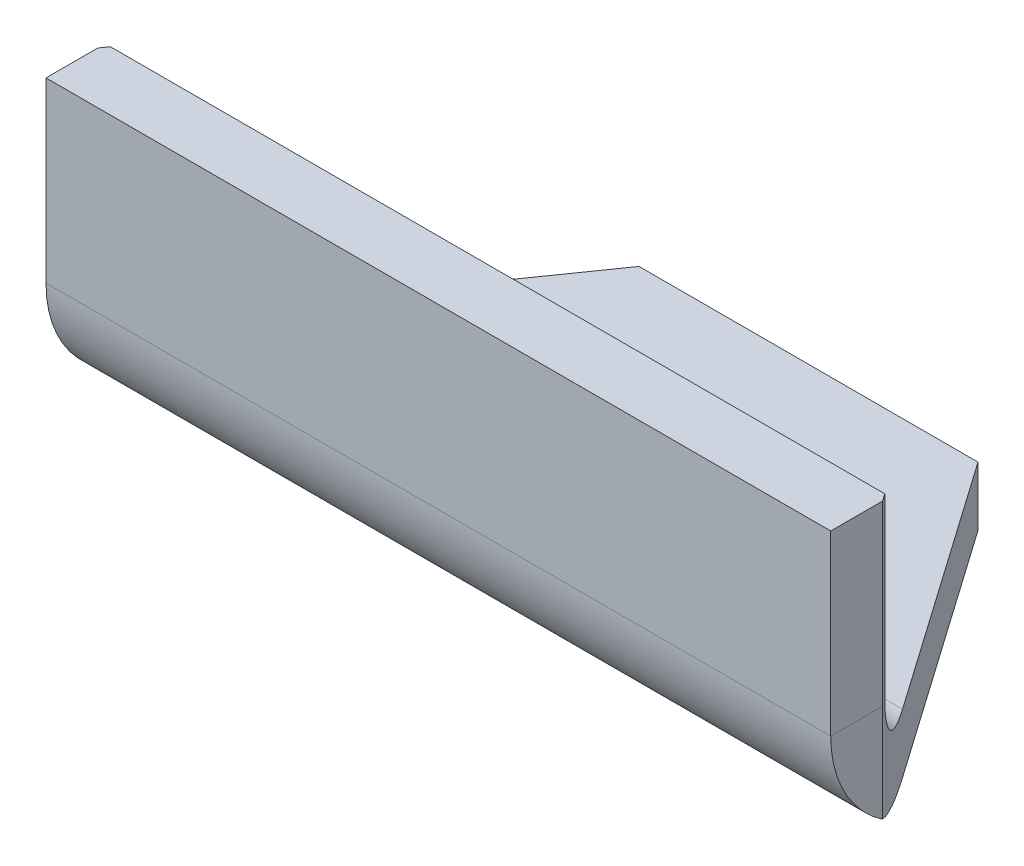
ISO-10303-21;
HEADER;
FILE_DESCRIPTION(('STEP AP214'),'2;1');
FILE_NAME('part.step','',(''),(''),'','','');
FILE_SCHEMA(('AUTOMOTIVE_DESIGN { 1 0 10303 214 1 1 1 1 }'));
ENDSEC;
DATA;
#1=APPLICATION_CONTEXT('core data for automotive mechanical design processes');
#2=APPLICATION_PROTOCOL_DEFINITION('international standard','automotive_design',2000,#1);
#3=PRODUCT_CONTEXT('',#1,'mechanical');
#4=PRODUCT('Part','Part','',(#3));
#5=PRODUCT_RELATED_PRODUCT_CATEGORY('part','',(#4));
#6=PRODUCT_DEFINITION_FORMATION('','',#4);
#7=PRODUCT_DEFINITION_CONTEXT('part definition',#1,'design');
#8=PRODUCT_DEFINITION('design','',#6,#7);
#9=PRODUCT_DEFINITION_SHAPE('','',#8);
#10=(LENGTH_UNIT() NAMED_UNIT(*) SI_UNIT(.MILLI.,.METRE.));
#11=(NAMED_UNIT(*) PLANE_ANGLE_UNIT() SI_UNIT($,.RADIAN.));
#12=(NAMED_UNIT(*) SI_UNIT($,.STERADIAN.) SOLID_ANGLE_UNIT());
#13=UNCERTAINTY_MEASURE_WITH_UNIT(LENGTH_MEASURE(1.E-05),#10,'distance_accuracy_value','');
#14=(GEOMETRIC_REPRESENTATION_CONTEXT(3) GLOBAL_UNCERTAINTY_ASSIGNED_CONTEXT((#13)) GLOBAL_UNIT_ASSIGNED_CONTEXT((#10,
#11,#12)) REPRESENTATION_CONTEXT('',''));
#15=CARTESIAN_POINT('',(0.,0.,0.));
#16=DIRECTION('',(0.,0.,1.));
#17=DIRECTION('',(1.,0.,0.));
#18=AXIS2_PLACEMENT_3D('',#15,#16,#17);
#19=CARTESIAN_POINT('',(0.,-8.,0.));
#20=DIRECTION('',(0.,-1.,0.));
#21=DIRECTION('',(0.,0.,-1.));
#22=AXIS2_PLACEMENT_3D('',#19,#20,#21);
#23=PLANE('',#22);
#24=DIRECTION('',(-1.,0.,0.));
#25=VECTOR('',#24,1.);
#26=CARTESIAN_POINT('',(-53.,-8.,-25.));
#27=LINE('',#26,#25);
#28=CARTESIAN_POINT('',(22.8910758569819,-8.,-25.));
#29=VERTEX_POINT('',#28);
#30=CARTESIAN_POINT('',(-22.8910758569819,-8.,-25.));
#31=VERTEX_POINT('',#30);
#32=EDGE_CURVE('E169',#29,#31,#27,.T.);
#33=ORIENTED_EDGE('',*,*,#32,.F.);
#34=DIRECTION('',(0.573576436351051,0.,0.819152044288988));
#35=VECTOR('',#34,1.);
#36=CARTESIAN_POINT('',(27.1063002110566,-8.,-18.9800357407575));
#37=LINE('',#36,#35);
#38=CARTESIAN_POINT('',(46.6981321561124,-8.00000000000003,9.00000000000001));
#39=VERTEX_POINT('',#38);
#40=EDGE_CURVE('E197',#39,#29,#37,.F.);
#41=ORIENTED_EDGE('',*,*,#40,.F.);
#42=DIRECTION('',(1.,0.,0.));
#43=VECTOR('',#42,1.);
#44=CARTESIAN_POINT('',(53.,-8.00000000000003,9.00000000000001));
#45=LINE('',#44,#43);
#46=CARTESIAN_POINT('',(-46.6981321561124,-8.00000000000003,9.00000000000001));
#47=VERTEX_POINT('',#46);
#48=EDGE_CURVE('E82',#39,#47,#45,.F.);
#49=ORIENTED_EDGE('',*,*,#48,.T.);
#50=DIRECTION('',(-0.573576436351051,0.,0.819152044288988));
#51=VECTOR('',#50,1.);
#52=CARTESIAN_POINT('',(-27.1063002110566,-8.,-18.9800357407575));
#53=LINE('',#52,#51);
#54=EDGE_CURVE('E13',#47,#31,#53,.F.);
#55=ORIENTED_EDGE('',*,*,#54,.T.);
#56=EDGE_LOOP('',(#33,#41,#49,#55));
#57=FACE_BOUND('',#56,.T.);
#58=ADVANCED_FACE('F59',(#57),#23,.T.);
#59=CARTESIAN_POINT('',(0.,0.,0.));
#60=DIRECTION('',(0.,-1.,0.));
#61=DIRECTION('',(0.,0.,-1.));
#62=AXIS2_PLACEMENT_3D('',#59,#60,#61);
#63=PLANE('',#62);
#64=DIRECTION('',(-0.573576436351051,0.,-0.819152044288988));
#65=VECTOR('',#64,1.);
#66=CARTESIAN_POINT('',(22.8910758569819,0.,-25.));
#67=LINE('',#66,#65);
#68=CARTESIAN_POINT('',(22.8910758569819,0.,-25.));
#69=VERTEX_POINT('',#68);
#70=CARTESIAN_POINT('',(46.6981321561124,0.,9.00000000000001));
#71=VERTEX_POINT('',#70);
#72=EDGE_CURVE('E204',#69,#71,#67,.F.);
#73=ORIENTED_EDGE('',*,*,#72,.F.);
#74=DIRECTION('',(-1.,0.,0.));
#75=VECTOR('',#74,1.);
#76=CARTESIAN_POINT('',(-53.,0.,-25.));
#77=LINE('',#76,#75);
#78=CARTESIAN_POINT('',(-22.8910758569819,0.,-25.));
#79=VERTEX_POINT('',#78);
#80=EDGE_CURVE('E172',#69,#79,#77,.T.);
#81=ORIENTED_EDGE('',*,*,#80,.T.);
#82=DIRECTION('',(0.573576436351051,0.,-0.819152044288988));
#83=VECTOR('',#82,1.);
#84=CARTESIAN_POINT('',(-22.8910758569819,0.,-25.));
#85=LINE('',#84,#83);
#86=CARTESIAN_POINT('',(-46.6981321561124,0.,9.00000000000001));
#87=VERTEX_POINT('',#86);
#88=EDGE_CURVE('E176',#79,#87,#85,.F.);
#89=ORIENTED_EDGE('',*,*,#88,.T.);
#90=DIRECTION('',(1.,0.,0.));
#91=VECTOR('',#90,1.);
#92=CARTESIAN_POINT('',(53.,0.,9.00000000000001));
#93=LINE('',#92,#91);
#94=EDGE_CURVE('E161',#71,#87,#93,.F.);
#95=ORIENTED_EDGE('',*,*,#94,.F.);
#96=EDGE_LOOP('',(#73,#81,#89,#95));
#97=FACE_BOUND('',#96,.T.);
#98=ADVANCED_FACE('F262',(#97),#63,.F.);
#99=CARTESIAN_POINT('',(-53.,-8.,-25.));
#100=DIRECTION('',(0.,0.,-1.));
#101=DIRECTION('',(-1.,0.,0.));
#102=AXIS2_PLACEMENT_3D('',#99,#100,#101);
#103=PLANE('',#102);
#104=ORIENTED_EDGE('',*,*,#80,.F.);
#105=DIRECTION('',(0.,1.,0.));
#106=VECTOR('',#105,1.);
#107=CARTESIAN_POINT('',(22.8910758569819,-8.,-25.));
#108=LINE('',#107,#106);
#109=EDGE_CURVE('E202',#29,#69,#108,.T.);
#110=ORIENTED_EDGE('',*,*,#109,.F.);
#111=ORIENTED_EDGE('',*,*,#32,.T.);
#112=DIRECTION('',(0.,1.,0.));
#113=VECTOR('',#112,1.);
#114=CARTESIAN_POINT('',(-22.8910758569819,-8.,-25.));
#115=LINE('',#114,#113);
#116=EDGE_CURVE('E171',#31,#79,#115,.T.);
#117=ORIENTED_EDGE('',*,*,#116,.T.);
#118=EDGE_LOOP('',(#104,#110,#111,#117));
#119=FACE_BOUND('',#118,.T.);
#120=ADVANCED_FACE('F201',(#119),#103,.T.);
#121=CARTESIAN_POINT('',(53.,7.99999999999997,9.00000000000001));
#122=DIRECTION('',(-1.,0.,0.));
#123=DIRECTION('',(0.,0.,1.));
#124=AXIS2_PLACEMENT_3D('',#121,#122,#123);
#125=PLANE('',#124);
#126=CARTESIAN_POINT('',(53.,7.99999999999997,9.00000000000001));
#127=DIRECTION('',(1.,0.,0.));
#128=DIRECTION('',(0.,0.,-1.));
#129=AXIS2_PLACEMENT_3D('',#126,#127,#128);
#130=CIRCLE('',#129,16.);
#131=CARTESIAN_POINT('',(53.,7.99999999999997,25.));
#132=VERTEX_POINT('',#131);
#133=CARTESIAN_POINT('',(53.,-5.22875655532285,18.0000000000002));
#134=VERTEX_POINT('',#133);
#135=EDGE_CURVE('E156',#132,#134,#130,.T.);
#136=ORIENTED_EDGE('',*,*,#135,.T.);
#137=DIRECTION('',(0.,-1.,0.));
#138=VECTOR('',#137,1.);
#139=CARTESIAN_POINT('',(53.,7.99999999999997,18.0000000000002));
#140=LINE('',#139,#138);
#141=CARTESIAN_POINT('',(53.,7.99999999999997,18.0000000000002));
#142=VERTEX_POINT('',#141);
#143=EDGE_CURVE('E142',#142,#134,#140,.T.);
#144=ORIENTED_EDGE('',*,*,#143,.F.);
#145=DIRECTION('',(0.,0.,-1.));
#146=VECTOR('',#145,1.);
#147=CARTESIAN_POINT('',(53.,7.99999999999997,17.));
#148=LINE('',#147,#146);
#149=EDGE_CURVE('E160',#142,#132,#148,.F.);
#150=ORIENTED_EDGE('',*,*,#149,.T.);
#151=EDGE_LOOP('',(#136,#144,#150));
#152=FACE_BOUND('',#151,.T.);
#153=ADVANCED_FACE('F159',(#152),#125,.F.);
#154=CARTESIAN_POINT('',(53.,7.99999999999997,9.00000000000001));
#155=DIRECTION('',(1.,0.,0.));
#156=DIRECTION('',(0.,0.,1.));
#157=AXIS2_PLACEMENT_3D('',#154,#155,#156);
#158=CYLINDRICAL_SURFACE('',#157,16.);
#159=ORIENTED_EDGE('',*,*,#48,.F.);
#160=CARTESIAN_POINT('',(46.6981321561124,7.99999999999997,9.00000000000001));
#161=DIRECTION('',(0.819152044288988,0.,-0.573576436351051));
#162=DIRECTION('',(-0.573576436351051,0.,-0.819152044288988));
#163=AXIS2_PLACEMENT_3D('',#160,#161,#162);
#164=ELLIPSE('',#163,19.5323934201834,16.);
#165=EDGE_CURVE('E145',#134,#39,#164,.T.);
#166=ORIENTED_EDGE('',*,*,#165,.F.);
#167=ORIENTED_EDGE('',*,*,#135,.F.);
#168=DIRECTION('',(1.,0.,0.));
#169=VECTOR('',#168,1.);
#170=CARTESIAN_POINT('',(-53.,7.99999999999997,25.));
#171=LINE('',#170,#169);
#172=CARTESIAN_POINT('',(-53.,7.99999999999997,25.));
#173=VERTEX_POINT('',#172);
#174=EDGE_CURVE('E226',#132,#173,#171,.F.);
#175=ORIENTED_EDGE('',*,*,#174,.T.);
#176=CARTESIAN_POINT('',(-53.,7.99999999999997,9.00000000000001));
#177=DIRECTION('',(1.,0.,0.));
#178=DIRECTION('',(0.,0.,-1.));
#179=AXIS2_PLACEMENT_3D('',#176,#177,#178);
#180=CIRCLE('',#179,16.);
#181=CARTESIAN_POINT('',(-53.,-5.22875655532285,18.0000000000002));
#182=VERTEX_POINT('',#181);
#183=EDGE_CURVE('E163',#182,#173,#180,.F.);
#184=ORIENTED_EDGE('',*,*,#183,.F.);
#185=CARTESIAN_POINT('',(-46.6981321561124,7.99999999999997,9.00000000000001));
#186=DIRECTION('',(0.819152044288988,0.,0.573576436351051));
#187=DIRECTION('',(0.573576436351051,0.,-0.819152044288988));
#188=AXIS2_PLACEMENT_3D('',#185,#186,#187);
#189=ELLIPSE('',#188,19.5323934201834,16.);
#190=EDGE_CURVE('E68',#182,#47,#189,.T.);
#191=ORIENTED_EDGE('',*,*,#190,.T.);
#192=EDGE_LOOP('',(#159,#166,#167,#175,#184,#191));
#193=FACE_BOUND('',#192,.T.);
#194=ADVANCED_FACE('F154',(#193),#158,.T.);
#195=CARTESIAN_POINT('',(53.,7.99999999999997,9.00000000000001));
#196=DIRECTION('',(1.,0.,0.));
#197=DIRECTION('',(0.,0.,1.));
#198=AXIS2_PLACEMENT_3D('',#195,#196,#197);
#199=CYLINDRICAL_SURFACE('',#198,8.);
#200=CARTESIAN_POINT('',(46.6981321561124,7.99999999999997,9.00000000000001));
#201=DIRECTION('',(0.819152044288988,0.,-0.573576436351051));
#202=DIRECTION('',(-0.573576436351051,0.,-0.819152044288988));
#203=AXIS2_PLACEMENT_3D('',#200,#201,#202);
#204=ELLIPSE('',#203,9.76619671009169,8.);
#205=CARTESIAN_POINT('',(52.2997924617901,7.99999999999997,17.));
#206=VERTEX_POINT('',#205);
#207=EDGE_CURVE('E208',#71,#206,#204,.F.);
#208=ORIENTED_EDGE('',*,*,#207,.F.);
#209=ORIENTED_EDGE('',*,*,#94,.T.);
#210=CARTESIAN_POINT('',(-46.6981321561124,7.99999999999997,9.00000000000001));
#211=DIRECTION('',(0.819152044288988,0.,0.573576436351051));
#212=DIRECTION('',(0.573576436351051,0.,-0.819152044288988));
#213=AXIS2_PLACEMENT_3D('',#210,#211,#212);
#214=ELLIPSE('',#213,9.76619671009169,8.);
#215=CARTESIAN_POINT('',(-52.2997924617901,7.99999999999997,17.));
#216=VERTEX_POINT('',#215);
#217=EDGE_CURVE('E179',#87,#216,#214,.F.);
#218=ORIENTED_EDGE('',*,*,#217,.T.);
#219=DIRECTION('',(1.,0.,0.));
#220=VECTOR('',#219,1.);
#221=CARTESIAN_POINT('',(-53.,7.99999999999997,17.));
#222=LINE('',#221,#220);
#223=EDGE_CURVE('E229',#216,#206,#222,.T.);
#224=ORIENTED_EDGE('',*,*,#223,.T.);
#225=EDGE_LOOP('',(#208,#209,#218,#224));
#226=FACE_BOUND('',#225,.T.);
#227=ADVANCED_FACE('F276',(#226),#199,.F.);
#228=CARTESIAN_POINT('',(53.,32.,25.));
#229=DIRECTION('',(-1.,0.,0.));
#230=DIRECTION('',(0.,0.,1.));
#231=AXIS2_PLACEMENT_3D('',#228,#229,#230);
#232=PLANE('',#231);
#233=CARTESIAN_POINT('',(53.,32.,18.0000000000002));
#234=VERTEX_POINT('',#233);
#235=EDGE_CURVE('E147',#234,#142,#140,.T.);
#236=ORIENTED_EDGE('',*,*,#235,.F.);
#237=DIRECTION('',(0.,0.,-1.));
#238=VECTOR('',#237,1.);
#239=CARTESIAN_POINT('',(53.,32.,25.));
#240=LINE('',#239,#238);
#241=CARTESIAN_POINT('',(53.,32.,25.));
#242=VERTEX_POINT('',#241);
#243=EDGE_CURVE('E165',#242,#234,#240,.T.);
#244=ORIENTED_EDGE('',*,*,#243,.F.);
#245=DIRECTION('',(0.,1.,0.));
#246=VECTOR('',#245,1.);
#247=CARTESIAN_POINT('',(53.,0.,25.));
#248=LINE('',#247,#246);
#249=EDGE_CURVE('E219',#132,#242,#248,.T.);
#250=ORIENTED_EDGE('',*,*,#249,.F.);
#251=ORIENTED_EDGE('',*,*,#149,.F.);
#252=EDGE_LOOP('',(#236,#244,#250,#251));
#253=FACE_BOUND('',#252,.T.);
#254=ADVANCED_FACE('F281',(#253),#232,.F.);
#255=CARTESIAN_POINT('',(0.,0.,17.));
#256=DIRECTION('',(0.,0.,-1.));
#257=DIRECTION('',(-1.,0.,0.));
#258=AXIS2_PLACEMENT_3D('',#255,#256,#257);
#259=PLANE('',#258);
#260=DIRECTION('',(1.,0.,0.));
#261=VECTOR('',#260,1.);
#262=CARTESIAN_POINT('',(-53.,32.,17.));
#263=LINE('',#262,#261);
#264=CARTESIAN_POINT('',(52.2997924617901,32.,17.));
#265=VERTEX_POINT('',#264);
#266=CARTESIAN_POINT('',(-52.2997924617901,32.,17.));
#267=VERTEX_POINT('',#266);
#268=EDGE_CURVE('E224',#265,#267,#263,.F.);
#269=ORIENTED_EDGE('',*,*,#268,.F.);
#270=DIRECTION('',(0.,-1.,0.));
#271=VECTOR('',#270,1.);
#272=CARTESIAN_POINT('',(52.2997924617901,0.,17.));
#273=LINE('',#272,#271);
#274=EDGE_CURVE('E75',#206,#265,#273,.F.);
#275=ORIENTED_EDGE('',*,*,#274,.F.);
#276=ORIENTED_EDGE('',*,*,#223,.F.);
#277=DIRECTION('',(0.,-1.,0.));
#278=VECTOR('',#277,1.);
#279=CARTESIAN_POINT('',(-52.2997924617901,0.,17.));
#280=LINE('',#279,#278);
#281=EDGE_CURVE('E181',#216,#267,#280,.F.);
#282=ORIENTED_EDGE('',*,*,#281,.T.);
#283=EDGE_LOOP('',(#269,#275,#276,#282));
#284=FACE_BOUND('',#283,.T.);
#285=ADVANCED_FACE('F257',(#284),#259,.T.);
#286=CARTESIAN_POINT('',(-53.,32.,25.));
#287=DIRECTION('',(0.,-1.,0.));
#288=DIRECTION('',(0.,0.,-1.));
#289=AXIS2_PLACEMENT_3D('',#286,#287,#288);
#290=PLANE('',#289);
#291=DIRECTION('',(-0.573576436351051,0.,-0.819152044288988));
#292=VECTOR('',#291,1.);
#293=CARTESIAN_POINT('',(22.8910758569819,32.,-25.));
#294=LINE('',#293,#292);
#295=EDGE_CURVE('E394',#265,#234,#294,.F.);
#296=ORIENTED_EDGE('',*,*,#295,.F.);
#297=ORIENTED_EDGE('',*,*,#268,.T.);
#298=DIRECTION('',(0.573576436351051,0.,-0.819152044288988));
#299=VECTOR('',#298,1.);
#300=CARTESIAN_POINT('',(-22.8910758569819,32.,-25.));
#301=LINE('',#300,#299);
#302=CARTESIAN_POINT('',(-53.,32.,18.0000000000002));
#303=VERTEX_POINT('',#302);
#304=EDGE_CURVE('E184',#267,#303,#301,.F.);
#305=ORIENTED_EDGE('',*,*,#304,.T.);
#306=DIRECTION('',(0.,0.,-1.));
#307=VECTOR('',#306,1.);
#308=CARTESIAN_POINT('',(-53.,32.,25.));
#309=LINE('',#308,#307);
#310=CARTESIAN_POINT('',(-53.,32.,25.));
#311=VERTEX_POINT('',#310);
#312=EDGE_CURVE('E214',#311,#303,#309,.T.);
#313=ORIENTED_EDGE('',*,*,#312,.F.);
#314=DIRECTION('',(-1.,0.,0.));
#315=VECTOR('',#314,1.);
#316=CARTESIAN_POINT('',(0.,32.,25.));
#317=LINE('',#316,#315);
#318=EDGE_CURVE('E217',#242,#311,#317,.T.);
#319=ORIENTED_EDGE('',*,*,#318,.F.);
#320=ORIENTED_EDGE('',*,*,#243,.T.);
#321=EDGE_LOOP('',(#296,#297,#305,#313,#319,#320));
#322=FACE_BOUND('',#321,.T.);
#323=ADVANCED_FACE('F246',(#322),#290,.F.);
#324=CARTESIAN_POINT('',(-53.,7.99999999999997,9.00000000000001));
#325=DIRECTION('',(-1.,0.,0.));
#326=DIRECTION('',(0.,0.,1.));
#327=AXIS2_PLACEMENT_3D('',#324,#325,#326);
#328=PLANE('',#327);
#329=DIRECTION('',(0.,0.,-1.));
#330=VECTOR('',#329,1.);
#331=CARTESIAN_POINT('',(-53.,7.99999999999997,25.));
#332=LINE('',#331,#330);
#333=CARTESIAN_POINT('',(-53.,7.99999999999997,18.0000000000002));
#334=VERTEX_POINT('',#333);
#335=EDGE_CURVE('E206',#334,#173,#332,.F.);
#336=ORIENTED_EDGE('',*,*,#335,.F.);
#337=DIRECTION('',(0.,-1.,0.));
#338=VECTOR('',#337,1.);
#339=CARTESIAN_POINT('',(-53.,7.99999999999997,18.0000000000002));
#340=LINE('',#339,#338);
#341=EDGE_CURVE('E188',#334,#182,#340,.T.);
#342=ORIENTED_EDGE('',*,*,#341,.T.);
#343=ORIENTED_EDGE('',*,*,#183,.T.);
#344=EDGE_LOOP('',(#336,#342,#343));
#345=FACE_BOUND('',#344,.T.);
#346=ADVANCED_FACE('F249',(#345),#328,.T.);
#347=CARTESIAN_POINT('',(-53.,0.,25.));
#348=DIRECTION('',(1.,0.,0.));
#349=DIRECTION('',(0.,0.,-1.));
#350=AXIS2_PLACEMENT_3D('',#347,#348,#349);
#351=PLANE('',#350);
#352=ORIENTED_EDGE('',*,*,#312,.T.);
#353=DIRECTION('',(0.,1.,0.));
#354=VECTOR('',#353,1.);
#355=CARTESIAN_POINT('',(-53.,-8.,18.0000000000002));
#356=LINE('',#355,#354);
#357=EDGE_CURVE('E186',#303,#334,#356,.F.);
#358=ORIENTED_EDGE('',*,*,#357,.T.);
#359=ORIENTED_EDGE('',*,*,#335,.T.);
#360=DIRECTION('',(0.,-1.,0.));
#361=VECTOR('',#360,1.);
#362=CARTESIAN_POINT('',(-53.,0.,25.));
#363=LINE('',#362,#361);
#364=EDGE_CURVE('E221',#311,#173,#363,.T.);
#365=ORIENTED_EDGE('',*,*,#364,.F.);
#366=EDGE_LOOP('',(#352,#358,#359,#365));
#367=FACE_BOUND('',#366,.T.);
#368=ADVANCED_FACE('F236',(#367),#351,.F.);
#369=CARTESIAN_POINT('',(0.,0.,25.));
#370=DIRECTION('',(0.,0.,-1.));
#371=DIRECTION('',(-1.,0.,0.));
#372=AXIS2_PLACEMENT_3D('',#369,#370,#371);
#373=PLANE('',#372);
#374=ORIENTED_EDGE('',*,*,#174,.F.);
#375=ORIENTED_EDGE('',*,*,#249,.T.);
#376=ORIENTED_EDGE('',*,*,#318,.T.);
#377=ORIENTED_EDGE('',*,*,#364,.T.);
#378=EDGE_LOOP('',(#374,#375,#376,#377));
#379=FACE_BOUND('',#378,.T.);
#380=ADVANCED_FACE('F241',(#379),#373,.F.);
#381=CARTESIAN_POINT('',(-22.8910758569819,-8.,-25.));
#382=DIRECTION('',(0.819152044288988,0.,0.573576436351051));
#383=DIRECTION('',(0.,1.,0.));
#384=AXIS2_PLACEMENT_3D('',#381,#382,#383);
#385=PLANE('',#384);
#386=ORIENTED_EDGE('',*,*,#190,.F.);
#387=ORIENTED_EDGE('',*,*,#341,.F.);
#388=ORIENTED_EDGE('',*,*,#357,.F.);
#389=ORIENTED_EDGE('',*,*,#304,.F.);
#390=ORIENTED_EDGE('',*,*,#281,.F.);
#391=ORIENTED_EDGE('',*,*,#217,.F.);
#392=ORIENTED_EDGE('',*,*,#88,.F.);
#393=ORIENTED_EDGE('',*,*,#116,.F.);
#394=ORIENTED_EDGE('',*,*,#54,.F.);
#395=EDGE_LOOP('',(#386,#387,#388,#389,#390,#391,#392,#393,#394));
#396=FACE_BOUND('',#395,.T.);
#397=ADVANCED_FACE('F62',(#396),#385,.F.);
#398=CARTESIAN_POINT('',(22.8910758569819,-8.,-25.));
#399=DIRECTION('',(-0.819152044288988,0.,0.573576436351051));
#400=DIRECTION('',(0.,1.,0.));
#401=AXIS2_PLACEMENT_3D('',#398,#399,#400);
#402=PLANE('',#401);
#403=ORIENTED_EDGE('',*,*,#165,.T.);
#404=ORIENTED_EDGE('',*,*,#40,.T.);
#405=ORIENTED_EDGE('',*,*,#109,.T.);
#406=ORIENTED_EDGE('',*,*,#72,.T.);
#407=ORIENTED_EDGE('',*,*,#207,.T.);
#408=ORIENTED_EDGE('',*,*,#274,.T.);
#409=ORIENTED_EDGE('',*,*,#295,.T.);
#410=ORIENTED_EDGE('',*,*,#235,.T.);
#411=ORIENTED_EDGE('',*,*,#143,.T.);
#412=EDGE_LOOP('',(#403,#404,#405,#406,#407,#408,#409,#410,#411));
#413=FACE_BOUND('',#412,.T.);
#414=ADVANCED_FACE('F144',(#413),#402,.F.);
#415=CLOSED_SHELL('',(#58,#98,#120,#153,#194,#227,#254,#285,#323,#346,#368,#380,#397,#414));
#416=MANIFOLD_SOLID_BREP('B2',#415);
#417=ADVANCED_BREP_SHAPE_REPRESENTATION('',(#18,#416),#14);
#418=SHAPE_DEFINITION_REPRESENTATION(#9,#417);
ENDSEC;
END-ISO-10303-21;
